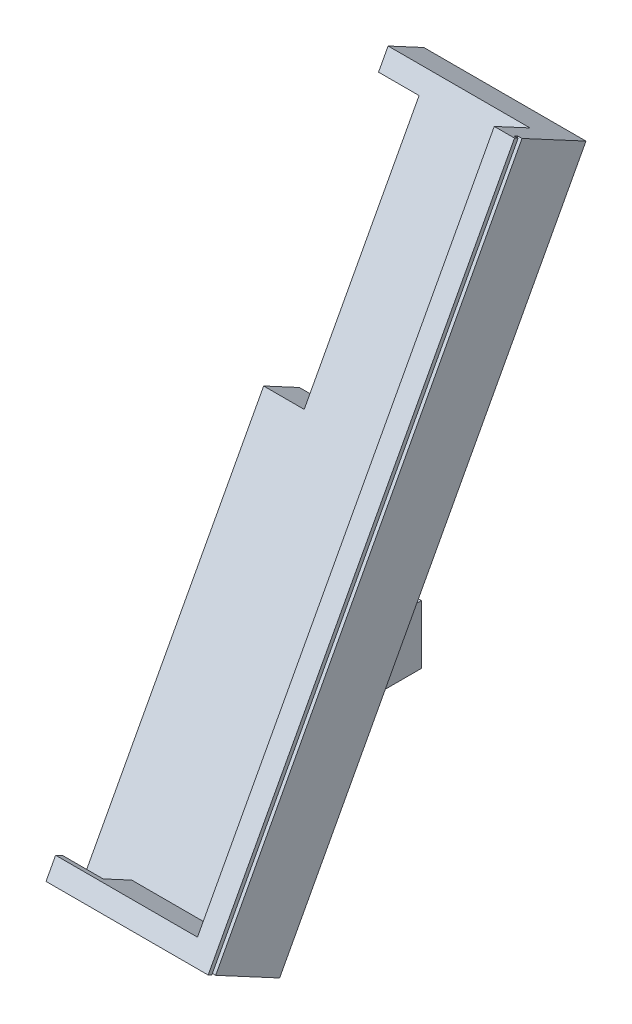
ISO-10303-21;
HEADER;
FILE_DESCRIPTION(('STEP AP214'),'2;1');
FILE_NAME('part.step','',(''),(''),'','','');
FILE_SCHEMA(('AUTOMOTIVE_DESIGN { 1 0 10303 214 1 1 1 1 }'));
ENDSEC;
DATA;
#1=APPLICATION_CONTEXT('core data for automotive mechanical design processes');
#2=APPLICATION_PROTOCOL_DEFINITION('international standard','automotive_design',2000,#1);
#3=PRODUCT_CONTEXT('',#1,'mechanical');
#4=PRODUCT('Part','Part','',(#3));
#5=PRODUCT_RELATED_PRODUCT_CATEGORY('part','',(#4));
#6=PRODUCT_DEFINITION_FORMATION('','',#4);
#7=PRODUCT_DEFINITION_CONTEXT('part definition',#1,'design');
#8=PRODUCT_DEFINITION('design','',#6,#7);
#9=PRODUCT_DEFINITION_SHAPE('','',#8);
#10=(LENGTH_UNIT() NAMED_UNIT(*) SI_UNIT(.MILLI.,.METRE.));
#11=(NAMED_UNIT(*) PLANE_ANGLE_UNIT() SI_UNIT($,.RADIAN.));
#12=(NAMED_UNIT(*) SI_UNIT($,.STERADIAN.) SOLID_ANGLE_UNIT());
#13=UNCERTAINTY_MEASURE_WITH_UNIT(LENGTH_MEASURE(1.E-05),#10,'distance_accuracy_value','');
#14=(GEOMETRIC_REPRESENTATION_CONTEXT(3) GLOBAL_UNCERTAINTY_ASSIGNED_CONTEXT((#13)) GLOBAL_UNIT_ASSIGNED_CONTEXT((#10,
#11,#12)) REPRESENTATION_CONTEXT('',''));
#15=CARTESIAN_POINT('',(0.,0.,0.));
#16=DIRECTION('',(0.,0.,1.));
#17=DIRECTION('',(1.,0.,0.));
#18=AXIS2_PLACEMENT_3D('',#15,#16,#17);
#19=CARTESIAN_POINT('',(40.,-30.9318929415671,64.0386236248852));
#20=DIRECTION('',(-1.,0.,0.));
#21=DIRECTION('',(0.,0.,1.));
#22=AXIS2_PLACEMENT_3D('',#19,#20,#21);
#23=PLANE('',#22);
#24=DIRECTION('',(0.,-0.472398321582941,-0.881385174464388));
#25=VECTOR('',#24,1.);
#26=CARTESIAN_POINT('',(40.,110.089734972735,-11.5451078283854));
#27=LINE('',#26,#25);
#28=CARTESIAN_POINT('',(40.,113.82168171324,-4.58216495011671));
#29=VERTEX_POINT('',#28);
#30=CARTESIAN_POINT('',(40.,105.365751756906,-20.3589595730293));
#31=VERTEX_POINT('',#30);
#32=EDGE_CURVE('E280',#29,#31,#27,.T.);
#33=ORIENTED_EDGE('',*,*,#32,.F.);
#34=DIRECTION('',(0.,0.881385174464388,-0.472398321582942));
#35=VECTOR('',#34,1.);
#36=CARTESIAN_POINT('',(40.,-27.1999462010618,71.001566503154));
#37=LINE('',#36,#35);
#38=CARTESIAN_POINT('',(40.,-27.1999462010618,71.001566503154));
#39=VERTEX_POINT('',#38);
#40=EDGE_CURVE('E329',#39,#29,#37,.T.);
#41=ORIENTED_EDGE('',*,*,#40,.F.);
#42=DIRECTION('',(0.,-0.472398321582941,-0.881385174464388));
#43=VECTOR('',#42,1.);
#44=CARTESIAN_POINT('',(40.,-30.9318929415671,64.0386236248852));
#45=LINE('',#44,#43);
#46=CARTESIAN_POINT('',(40.,-35.6558761573965,55.2247718802414));
#47=VERTEX_POINT('',#46);
#48=EDGE_CURVE('E269',#39,#47,#45,.T.);
#49=ORIENTED_EDGE('',*,*,#48,.T.);
#50=DIRECTION('',(0.,0.881385174464388,-0.472398321582941));
#51=VECTOR('',#50,1.);
#52=CARTESIAN_POINT('',(40.,-35.6558761573965,55.2247718802414));
#53=LINE('',#52,#51);
#54=EDGE_CURVE('E265',#47,#31,#53,.T.);
#55=ORIENTED_EDGE('',*,*,#54,.T.);
#56=EDGE_LOOP('',(#33,#41,#49,#55));
#57=FACE_BOUND('',#56,.T.);
#58=ADVANCED_FACE('F37',(#57),#23,.F.);
#59=CARTESIAN_POINT('',(-40.,-30.9318929415671,64.0386236248852));
#60=DIRECTION('',(0.,0.881385174464388,-0.472398321582941));
#61=DIRECTION('',(0.,0.472398321582941,0.881385174464388));
#62=AXIS2_PLACEMENT_3D('',#59,#60,#61);
#63=PLANE('',#62);
#64=DIRECTION('',(1.,0.,0.));
#65=VECTOR('',#64,1.);
#66=CARTESIAN_POINT('',(-40.,-26.2079097257377,72.8524753695292));
#67=LINE('',#66,#65);
#68=CARTESIAN_POINT('',(0.,-26.2079097257377,72.8524753695292));
#69=VERTEX_POINT('',#68);
#70=CARTESIAN_POINT('',(40.,-26.2079097257377,72.8524753695292));
#71=VERTEX_POINT('',#70);
#72=EDGE_CURVE('E200',#69,#71,#67,.T.);
#73=ORIENTED_EDGE('',*,*,#72,.F.);
#74=DIRECTION('',(0.,-0.472398321582941,-0.881385174464388));
#75=VECTOR('',#74,1.);
#76=CARTESIAN_POINT('',(0.,-30.9318929415671,64.0386236248852));
#77=LINE('',#76,#75);
#78=CARTESIAN_POINT('',(0.,-27.1527063689036,71.0897050206003));
#79=VERTEX_POINT('',#78);
#80=EDGE_CURVE('E186',#69,#79,#77,.T.);
#81=ORIENTED_EDGE('',*,*,#80,.T.);
#82=DIRECTION('',(-1.,0.,0.));
#83=VECTOR('',#82,1.);
#84=CARTESIAN_POINT('',(-10.0273045150152,-27.1527063689036,71.0897050206003));
#85=LINE('',#84,#83);
#86=CARTESIAN_POINT('',(9.97269548498479,-27.1527063689036,71.0897050206003));
#87=VERTEX_POINT('',#86);
#88=EDGE_CURVE('E198',#87,#79,#85,.T.);
#89=ORIENTED_EDGE('',*,*,#88,.F.);
#90=DIRECTION('',(0.,0.472398321582942,0.881385174464388));
#91=VECTOR('',#90,1.);
#92=CARTESIAN_POINT('',(9.9726954849848,-30.9318929415671,64.0386236248852));
#93=LINE('',#92,#91);
#94=CARTESIAN_POINT('',(9.9726954849848,-30.9318929415671,64.0386236248852));
#95=VERTEX_POINT('',#94);
#96=EDGE_CURVE('E209',#95,#87,#93,.T.);
#97=ORIENTED_EDGE('',*,*,#96,.F.);
#98=DIRECTION('',(1.,0.,0.));
#99=VECTOR('',#98,1.);
#100=CARTESIAN_POINT('',(-10.0273045150152,-30.9318929415671,64.0386236248852));
#101=LINE('',#100,#99);
#102=CARTESIAN_POINT('',(0.,-30.9318929415671,64.0386236248853));
#103=VERTEX_POINT('',#102);
#104=EDGE_CURVE('E208',#103,#95,#101,.T.);
#105=ORIENTED_EDGE('',*,*,#104,.F.);
#106=CARTESIAN_POINT('',(0.,-35.6558761573965,55.2247718802414));
#107=VERTEX_POINT('',#106);
#108=EDGE_CURVE('E203',#103,#107,#77,.T.);
#109=ORIENTED_EDGE('',*,*,#108,.T.);
#110=DIRECTION('',(1.,0.,0.));
#111=VECTOR('',#110,1.);
#112=CARTESIAN_POINT('',(-40.,-35.6558761573965,55.2247718802414));
#113=LINE('',#112,#111);
#114=EDGE_CURVE('E270',#107,#47,#113,.T.);
#115=ORIENTED_EDGE('',*,*,#114,.T.);
#116=ORIENTED_EDGE('',*,*,#48,.F.);
#117=DIRECTION('',(1.,0.,0.));
#118=VECTOR('',#117,1.);
#119=CARTESIAN_POINT('',(39.,-27.1999462010618,71.001566503154));
#120=LINE('',#119,#118);
#121=CARTESIAN_POINT('',(39.,-27.1999462010618,71.001566503154));
#122=VERTEX_POINT('',#121);
#123=EDGE_CURVE('E332',#122,#39,#120,.T.);
#124=ORIENTED_EDGE('',*,*,#123,.F.);
#125=DIRECTION('',(0.,-0.47239832158294,-0.881385174464389));
#126=VECTOR('',#125,1.);
#127=CARTESIAN_POINT('',(39.,-26.6803080473206,71.9710901950648));
#128=LINE('',#127,#126);
#129=CARTESIAN_POINT('',(39.,-26.6803080473206,71.9710901950648));
#130=VERTEX_POINT('',#129);
#131=EDGE_CURVE('E334',#130,#122,#128,.T.);
#132=ORIENTED_EDGE('',*,*,#131,.F.);
#133=DIRECTION('',(1.,0.,0.));
#134=VECTOR('',#133,1.);
#135=CARTESIAN_POINT('',(39.,-26.6803080473206,71.9710901950648));
#136=LINE('',#135,#134);
#137=CARTESIAN_POINT('',(40.,-26.6803080473206,71.9710901950648));
#138=VERTEX_POINT('',#137);
#139=EDGE_CURVE('E337',#130,#138,#136,.T.);
#140=ORIENTED_EDGE('',*,*,#139,.T.);
#141=EDGE_CURVE('E277',#71,#138,#45,.T.);
#142=ORIENTED_EDGE('',*,*,#141,.F.);
#143=EDGE_LOOP('',(#73,#81,#89,#97,#105,#109,#115,#116,#124,#132,#140,#142));
#144=FACE_BOUND('',#143,.T.);
#145=ADVANCED_FACE('F196',(#144),#63,.F.);
#146=CARTESIAN_POINT('',(0.,19.7606670360328,36.868799416402));
#147=DIRECTION('',(0.,-0.472398321582942,-0.881385174464388));
#148=DIRECTION('',(0.,0.881385174464388,-0.472398321582942));
#149=AXIS2_PLACEMENT_3D('',#146,#147,#148);
#150=PLANE('',#149);
#151=DIRECTION('',(-1.,0.,0.));
#152=VECTOR('',#151,1.);
#153=CARTESIAN_POINT('',(-40.,110.089734972735,-11.5451078283854));
#154=LINE('',#153,#152);
#155=CARTESIAN_POINT('',(35.,110.089734972735,-11.5451078283854));
#156=VERTEX_POINT('',#155);
#157=CARTESIAN_POINT('',(0.,110.089734972735,-11.5451078283854));
#158=VERTEX_POINT('',#157);
#159=EDGE_CURVE('E266',#156,#158,#154,.T.);
#160=ORIENTED_EDGE('',*,*,#159,.T.);
#161=DIRECTION('',(0.,-0.881385174464388,0.472398321582942));
#162=VECTOR('',#161,1.);
#163=CARTESIAN_POINT('',(0.,19.7606670360328,36.868799416402));
#164=LINE('',#163,#162);
#165=CARTESIAN_POINT('',(0.,105.682809100413,-9.18311622047066));
#166=VERTEX_POINT('',#165);
#167=EDGE_CURVE('E376',#158,#166,#164,.T.);
#168=ORIENTED_EDGE('',*,*,#167,.T.);
#169=DIRECTION('',(-1.,0.,0.));
#170=VECTOR('',#169,1.);
#171=CARTESIAN_POINT('',(-30.,105.682809100413,-9.18311622047065));
#172=LINE('',#171,#170);
#173=CARTESIAN_POINT('',(9.99999999999999,105.682809100413,-9.18311622047067));
#174=VERTEX_POINT('',#173);
#175=EDGE_CURVE('E232',#174,#166,#172,.T.);
#176=ORIENTED_EDGE('',*,*,#175,.F.);
#177=DIRECTION('',(0.,0.881385174464388,-0.472398321582941));
#178=VECTOR('',#177,1.);
#179=CARTESIAN_POINT('',(9.99999999999999,52.7996986325498,19.1607830745058));
#180=LINE('',#179,#178);
#181=CARTESIAN_POINT('',(9.99999999999999,52.7996986325498,19.1607830745058));
#182=VERTEX_POINT('',#181);
#183=EDGE_CURVE('E219',#182,#174,#180,.T.);
#184=ORIENTED_EDGE('',*,*,#183,.F.);
#185=DIRECTION('',(1.,0.,0.));
#186=VECTOR('',#185,1.);
#187=CARTESIAN_POINT('',(-30.,52.7996986325498,19.1607830745058));
#188=LINE('',#187,#186);
#189=CARTESIAN_POINT('',(0.,52.7996986325498,19.1607830745058));
#190=VERTEX_POINT('',#189);
#191=EDGE_CURVE('E225',#190,#182,#188,.T.);
#192=ORIENTED_EDGE('',*,*,#191,.F.);
#193=EDGE_CURVE('E52',#190,#103,#164,.T.);
#194=ORIENTED_EDGE('',*,*,#193,.T.);
#195=ORIENTED_EDGE('',*,*,#104,.T.);
#196=DIRECTION('',(0.,-0.881385174464388,0.472398321582942));
#197=VECTOR('',#196,1.);
#198=CARTESIAN_POINT('',(9.9726954849848,-22.1180411969232,59.3146404090558));
#199=LINE('',#198,#197);
#200=CARTESIAN_POINT('',(9.9726954849848,-26.5249670692452,61.6766320169705));
#201=VERTEX_POINT('',#200);
#202=EDGE_CURVE('E216',#201,#95,#199,.T.);
#203=ORIENTED_EDGE('',*,*,#202,.F.);
#204=DIRECTION('',(-1.,0.,0.));
#205=VECTOR('',#204,1.);
#206=CARTESIAN_POINT('',(-35.,-26.5249670692452,61.6766320169706));
#207=LINE('',#206,#205);
#208=CARTESIAN_POINT('',(35.,-26.5249670692452,61.6766320169705));
#209=VERTEX_POINT('',#208);
#210=EDGE_CURVE('E246',#209,#201,#207,.T.);
#211=ORIENTED_EDGE('',*,*,#210,.F.);
#212=DIRECTION('',(0.,-0.881385174464388,0.472398321582942));
#213=VECTOR('',#212,1.);
#214=CARTESIAN_POINT('',(35.,-26.5249670692452,61.6766320169706));
#215=LINE('',#214,#213);
#216=EDGE_CURVE('E239',#156,#209,#215,.T.);
#217=ORIENTED_EDGE('',*,*,#216,.F.);
#218=EDGE_LOOP('',(#160,#168,#176,#184,#192,#194,#195,#203,#211,#217));
#219=FACE_BOUND('',#218,.T.);
#220=ADVANCED_FACE('F312',(#219),#150,.F.);
#221=CARTESIAN_POINT('',(19.75,-7.25,40.));
#222=DIRECTION('',(-1.,0.,0.));
#223=DIRECTION('',(0.,0.,1.));
#224=AXIS2_PLACEMENT_3D('',#221,#222,#223);
#225=PLANE('',#224);
#226=DIRECTION('',(0.,0.,-1.));
#227=VECTOR('',#226,1.);
#228=CARTESIAN_POINT('',(19.75,7.25,40.));
#229=LINE('',#228,#227);
#230=CARTESIAN_POINT('',(19.75,7.25,32.2283970034835));
#231=VERTEX_POINT('',#230);
#232=CARTESIAN_POINT('',(19.75,7.25,0.));
#233=VERTEX_POINT('',#232);
#234=EDGE_CURVE('E302',#231,#233,#229,.T.);
#235=ORIENTED_EDGE('',*,*,#234,.F.);
#236=DIRECTION('',(0.,-0.881385174464388,0.472398321582942));
#237=VECTOR('',#236,1.);
#238=CARTESIAN_POINT('',(19.75,-7.24999999999999,40.));
#239=LINE('',#238,#237);
#240=CARTESIAN_POINT('',(19.75,-7.24999999999994,40.));
#241=VERTEX_POINT('',#240);
#242=EDGE_CURVE('E286',#231,#241,#239,.T.);
#243=ORIENTED_EDGE('',*,*,#242,.T.);
#244=DIRECTION('',(0.,0.,-1.));
#245=VECTOR('',#244,1.);
#246=CARTESIAN_POINT('',(19.75,-7.25,40.));
#247=LINE('',#246,#245);
#248=CARTESIAN_POINT('',(19.75,-7.25,0.));
#249=VERTEX_POINT('',#248);
#250=EDGE_CURVE('E292',#241,#249,#247,.T.);
#251=ORIENTED_EDGE('',*,*,#250,.T.);
#252=DIRECTION('',(0.,1.,0.));
#253=VECTOR('',#252,1.);
#254=CARTESIAN_POINT('',(19.75,-7.25,0.));
#255=LINE('',#254,#253);
#256=EDGE_CURVE('E289',#249,#233,#255,.T.);
#257=ORIENTED_EDGE('',*,*,#256,.T.);
#258=EDGE_LOOP('',(#235,#243,#251,#257));
#259=FACE_BOUND('',#258,.T.);
#260=ADVANCED_FACE('F39',(#259),#225,.F.);
#261=CARTESIAN_POINT('',(-19.75,7.25,40.));
#262=DIRECTION('',(0.,-1.,0.));
#263=DIRECTION('',(0.,0.,-1.));
#264=AXIS2_PLACEMENT_3D('',#261,#262,#263);
#265=PLANE('',#264);
#266=DIRECTION('',(-1.,0.,0.));
#267=VECTOR('',#266,1.);
#268=CARTESIAN_POINT('',(-19.75,7.25,0.));
#269=LINE('',#268,#267);
#270=CARTESIAN_POINT('',(0.,7.25,0.));
#271=VERTEX_POINT('',#270);
#272=EDGE_CURVE('E296',#233,#271,#269,.T.);
#273=ORIENTED_EDGE('',*,*,#272,.T.);
#274=DIRECTION('',(0.,0.,1.));
#275=VECTOR('',#274,1.);
#276=CARTESIAN_POINT('',(0.,7.25,40.));
#277=LINE('',#276,#275);
#278=CARTESIAN_POINT('',(0.,7.25,32.2283970034835));
#279=VERTEX_POINT('',#278);
#280=EDGE_CURVE('E367',#271,#279,#277,.T.);
#281=ORIENTED_EDGE('',*,*,#280,.T.);
#282=DIRECTION('',(1.,0.,0.));
#283=VECTOR('',#282,1.);
#284=CARTESIAN_POINT('',(-19.75,7.25,32.2283970034835));
#285=LINE('',#284,#283);
#286=EDGE_CURVE('E284',#279,#231,#285,.T.);
#287=ORIENTED_EDGE('',*,*,#286,.T.);
#288=ORIENTED_EDGE('',*,*,#234,.T.);
#289=EDGE_LOOP('',(#273,#281,#287,#288));
#290=FACE_BOUND('',#289,.T.);
#291=ADVANCED_FACE('F423',(#290),#265,.F.);
#292=CARTESIAN_POINT('',(-19.75,-7.25,40.));
#293=DIRECTION('',(0.,1.,0.));
#294=DIRECTION('',(0.,0.,1.));
#295=AXIS2_PLACEMENT_3D('',#292,#293,#294);
#296=PLANE('',#295);
#297=DIRECTION('',(1.,0.,0.));
#298=VECTOR('',#297,1.);
#299=CARTESIAN_POINT('',(-19.75,-7.25,40.));
#300=LINE('',#299,#298);
#301=CARTESIAN_POINT('',(0.,-7.24999999999997,40.));
#302=VERTEX_POINT('',#301);
#303=EDGE_CURVE('E290',#302,#241,#300,.T.);
#304=ORIENTED_EDGE('',*,*,#303,.F.);
#305=DIRECTION('',(0.,0.,-1.));
#306=VECTOR('',#305,1.);
#307=CARTESIAN_POINT('',(0.,-7.25,40.));
#308=LINE('',#307,#306);
#309=CARTESIAN_POINT('',(0.,-7.25,0.));
#310=VERTEX_POINT('',#309);
#311=EDGE_CURVE('E357',#302,#310,#308,.T.);
#312=ORIENTED_EDGE('',*,*,#311,.T.);
#313=DIRECTION('',(1.,0.,0.));
#314=VECTOR('',#313,1.);
#315=CARTESIAN_POINT('',(-19.75,-7.25,0.));
#316=LINE('',#315,#314);
#317=EDGE_CURVE('E293',#310,#249,#316,.T.);
#318=ORIENTED_EDGE('',*,*,#317,.T.);
#319=ORIENTED_EDGE('',*,*,#250,.F.);
#320=EDGE_LOOP('',(#304,#312,#318,#319));
#321=FACE_BOUND('',#320,.T.);
#322=ADVANCED_FACE('F414',(#321),#296,.F.);
#323=CARTESIAN_POINT('',(0.,0.,0.));
#324=DIRECTION('',(0.,0.,-1.));
#325=DIRECTION('',(-1.,0.,0.));
#326=AXIS2_PLACEMENT_3D('',#323,#324,#325);
#327=PLANE('',#326);
#328=DIRECTION('',(0.,-1.,0.));
#329=VECTOR('',#328,1.);
#330=CARTESIAN_POINT('',(0.,0.,0.));
#331=LINE('',#330,#329);
#332=EDGE_CURVE('E365',#271,#310,#331,.T.);
#333=ORIENTED_EDGE('',*,*,#332,.F.);
#334=ORIENTED_EDGE('',*,*,#272,.F.);
#335=ORIENTED_EDGE('',*,*,#256,.F.);
#336=ORIENTED_EDGE('',*,*,#317,.F.);
#337=EDGE_LOOP('',(#333,#334,#335,#336));
#338=FACE_BOUND('',#337,.T.);
#339=ADVANCED_FACE('F418',(#338),#327,.T.);
#340=CARTESIAN_POINT('',(0.,15.0366838202034,28.0549476717581));
#341=DIRECTION('',(0.,-0.472398321582942,-0.881385174464388));
#342=DIRECTION('',(0.,0.881385174464388,-0.472398321582942));
#343=AXIS2_PLACEMENT_3D('',#340,#341,#342);
#344=PLANE('',#343);
#345=DIRECTION('',(0.,-0.881385174464388,0.472398321582942));
#346=VECTOR('',#345,1.);
#347=CARTESIAN_POINT('',(0.,15.0366838202034,28.0549476717581));
#348=LINE('',#347,#346);
#349=CARTESIAN_POINT('',(0.,105.365751756906,-20.3589595730293));
#350=VERTEX_POINT('',#349);
#351=CARTESIAN_POINT('',(0.,100.958825884584,-17.9969679651145));
#352=VERTEX_POINT('',#351);
#353=EDGE_CURVE('E60',#350,#352,#348,.T.);
#354=ORIENTED_EDGE('',*,*,#353,.F.);
#355=DIRECTION('',(-1.,0.,0.));
#356=VECTOR('',#355,1.);
#357=CARTESIAN_POINT('',(-40.,105.365751756906,-20.3589595730293));
#358=LINE('',#357,#356);
#359=EDGE_CURVE('E273',#31,#350,#358,.T.);
#360=ORIENTED_EDGE('',*,*,#359,.F.);
#361=ORIENTED_EDGE('',*,*,#54,.F.);
#362=ORIENTED_EDGE('',*,*,#114,.F.);
#363=EDGE_CURVE('E319',#302,#107,#348,.T.);
#364=ORIENTED_EDGE('',*,*,#363,.F.);
#365=ORIENTED_EDGE('',*,*,#303,.T.);
#366=ORIENTED_EDGE('',*,*,#242,.F.);
#367=ORIENTED_EDGE('',*,*,#286,.F.);
#368=CARTESIAN_POINT('',(0.,48.0757154167204,10.3469313298619));
#369=VERTEX_POINT('',#368);
#370=EDGE_CURVE('E370',#369,#279,#348,.T.);
#371=ORIENTED_EDGE('',*,*,#370,.F.);
#372=DIRECTION('',(1.,0.,0.));
#373=VECTOR('',#372,1.);
#374=CARTESIAN_POINT('',(-30.,48.0757154167204,10.3469313298619));
#375=LINE('',#374,#373);
#376=CARTESIAN_POINT('',(9.99999999999999,48.0757154167204,10.3469313298619));
#377=VERTEX_POINT('',#376);
#378=EDGE_CURVE('E228',#369,#377,#375,.T.);
#379=ORIENTED_EDGE('',*,*,#378,.T.);
#380=DIRECTION('',(0.,0.881385174464388,-0.472398321582941));
#381=VECTOR('',#380,1.);
#382=CARTESIAN_POINT('',(9.99999999999999,48.0757154167204,10.3469313298619));
#383=LINE('',#382,#381);
#384=CARTESIAN_POINT('',(9.99999999999999,100.958825884584,-17.9969679651145));
#385=VERTEX_POINT('',#384);
#386=EDGE_CURVE('E221',#377,#385,#383,.T.);
#387=ORIENTED_EDGE('',*,*,#386,.T.);
#388=DIRECTION('',(-1.,0.,0.));
#389=VECTOR('',#388,1.);
#390=CARTESIAN_POINT('',(-30.,100.958825884584,-17.9969679651145));
#391=LINE('',#390,#389);
#392=EDGE_CURVE('E224',#385,#352,#391,.T.);
#393=ORIENTED_EDGE('',*,*,#392,.T.);
#394=EDGE_LOOP('',(#354,#360,#361,#362,#364,#365,#366,#367,#371,#379,#387,#393));
#395=FACE_BOUND('',#394,.T.);
#396=ADVANCED_FACE('F323',(#395),#344,.T.);
#397=ORIENTED_EDGE('',*,*,#141,.T.);
#398=DIRECTION('',(0.,-0.881385174464388,0.472398321582941));
#399=VECTOR('',#398,1.);
#400=CARTESIAN_POINT('',(40.,114.341319866981,-3.61264125820589));
#401=LINE('',#400,#399);
#402=CARTESIAN_POINT('',(40.,114.341319866981,-3.61264125820589));
#403=VERTEX_POINT('',#402);
#404=EDGE_CURVE('E356',#403,#138,#401,.T.);
#405=ORIENTED_EDGE('',*,*,#404,.F.);
#406=CARTESIAN_POINT('',(40.,114.813718188564,-2.73125608374151));
#407=VERTEX_POINT('',#406);
#408=EDGE_CURVE('E281',#407,#403,#27,.T.);
#409=ORIENTED_EDGE('',*,*,#408,.F.);
#410=DIRECTION('',(0.,0.881385174464388,-0.472398321582942));
#411=VECTOR('',#410,1.);
#412=CARTESIAN_POINT('',(40.,-26.2079097257377,72.8524753695292));
#413=LINE('',#412,#411);
#414=EDGE_CURVE('E252',#71,#407,#413,.T.);
#415=ORIENTED_EDGE('',*,*,#414,.F.);
#416=EDGE_LOOP('',(#397,#405,#409,#415));
#417=FACE_BOUND('',#416,.T.);
#418=ADVANCED_FACE('F433',(#417),#23,.F.);
#419=CARTESIAN_POINT('',(-40.,110.089734972735,-11.5451078283854));
#420=DIRECTION('',(0.,-0.881385174464388,0.472398321582941));
#421=DIRECTION('',(0.,-0.472398321582941,-0.881385174464388));
#422=AXIS2_PLACEMENT_3D('',#419,#420,#421);
#423=PLANE('',#422);
#424=ORIENTED_EDGE('',*,*,#359,.T.);
#425=DIRECTION('',(0.,0.472398321582941,0.881385174464388));
#426=VECTOR('',#425,1.);
#427=CARTESIAN_POINT('',(0.,110.089734972735,-11.5451078283854));
#428=LINE('',#427,#426);
#429=EDGE_CURVE('E373',#350,#158,#428,.T.);
#430=ORIENTED_EDGE('',*,*,#429,.T.);
#431=ORIENTED_EDGE('',*,*,#159,.F.);
#432=DIRECTION('',(0.,-0.472398321582942,-0.881385174464388));
#433=VECTOR('',#432,1.);
#434=CARTESIAN_POINT('',(35.,114.813718188564,-2.7312560837415));
#435=LINE('',#434,#433);
#436=CARTESIAN_POINT('',(35.,114.813718188564,-2.7312560837415));
#437=VERTEX_POINT('',#436);
#438=EDGE_CURVE('E262',#437,#156,#435,.T.);
#439=ORIENTED_EDGE('',*,*,#438,.F.);
#440=DIRECTION('',(-1.,0.,0.));
#441=VECTOR('',#440,1.);
#442=CARTESIAN_POINT('',(40.,114.813718188564,-2.73125608374151));
#443=LINE('',#442,#441);
#444=EDGE_CURVE('E242',#407,#437,#443,.T.);
#445=ORIENTED_EDGE('',*,*,#444,.F.);
#446=ORIENTED_EDGE('',*,*,#408,.T.);
#447=DIRECTION('',(1.,0.,0.));
#448=VECTOR('',#447,1.);
#449=CARTESIAN_POINT('',(39.,114.341319866981,-3.61264125820589));
#450=LINE('',#449,#448);
#451=CARTESIAN_POINT('',(39.,114.341319866981,-3.61264125820589));
#452=VERTEX_POINT('',#451);
#453=EDGE_CURVE('E341',#452,#403,#450,.T.);
#454=ORIENTED_EDGE('',*,*,#453,.F.);
#455=DIRECTION('',(0.,0.472398321582939,0.881385174464389));
#456=VECTOR('',#455,1.);
#457=CARTESIAN_POINT('',(39.,113.82168171324,-4.58216495011671));
#458=LINE('',#457,#456);
#459=CARTESIAN_POINT('',(39.,113.82168171324,-4.58216495011671));
#460=VERTEX_POINT('',#459);
#461=EDGE_CURVE('E358',#460,#452,#458,.T.);
#462=ORIENTED_EDGE('',*,*,#461,.F.);
#463=DIRECTION('',(1.,0.,0.));
#464=VECTOR('',#463,1.);
#465=CARTESIAN_POINT('',(39.,113.82168171324,-4.58216495011671));
#466=LINE('',#465,#464);
#467=EDGE_CURVE('E212',#460,#29,#466,.T.);
#468=ORIENTED_EDGE('',*,*,#467,.T.);
#469=ORIENTED_EDGE('',*,*,#32,.T.);
#470=EDGE_LOOP('',(#424,#430,#431,#439,#445,#446,#454,#462,#468,#469));
#471=FACE_BOUND('',#470,.T.);
#472=ADVANCED_FACE('F393',(#471),#423,.F.);
#473=CARTESIAN_POINT('',(35.,-21.8009838534158,70.4904837616144));
#474=DIRECTION('',(1.,0.,0.));
#475=DIRECTION('',(0.,0.,-1.));
#476=AXIS2_PLACEMENT_3D('',#473,#474,#475);
#477=PLANE('',#476);
#478=ORIENTED_EDGE('',*,*,#216,.T.);
#479=DIRECTION('',(0.,-0.472398321582942,-0.881385174464388));
#480=VECTOR('',#479,1.);
#481=CARTESIAN_POINT('',(35.,-21.8009838534158,70.4904837616144));
#482=LINE('',#481,#480);
#483=CARTESIAN_POINT('',(35.,-21.8009838534158,70.4904837616144));
#484=VERTEX_POINT('',#483);
#485=EDGE_CURVE('E255',#484,#209,#482,.T.);
#486=ORIENTED_EDGE('',*,*,#485,.F.);
#487=DIRECTION('',(0.,-0.881385174464388,0.472398321582942));
#488=VECTOR('',#487,1.);
#489=CARTESIAN_POINT('',(35.,-21.8009838534158,70.4904837616144));
#490=LINE('',#489,#488);
#491=EDGE_CURVE('E245',#437,#484,#490,.T.);
#492=ORIENTED_EDGE('',*,*,#491,.F.);
#493=ORIENTED_EDGE('',*,*,#438,.T.);
#494=EDGE_LOOP('',(#478,#486,#492,#493));
#495=FACE_BOUND('',#494,.T.);
#496=ADVANCED_FACE('F390',(#495),#477,.F.);
#497=CARTESIAN_POINT('',(-35.,-21.8009838534158,70.4904837616144));
#498=DIRECTION('',(0.,-0.881385174464388,0.472398321582942));
#499=DIRECTION('',(0.,-0.472398321582942,-0.881385174464388));
#500=AXIS2_PLACEMENT_3D('',#497,#498,#499);
#501=PLANE('',#500);
#502=DIRECTION('',(-1.,0.,0.));
#503=VECTOR('',#502,1.);
#504=CARTESIAN_POINT('',(-35.,-22.7457804965817,68.7277134126856));
#505=LINE('',#504,#503);
#506=CARTESIAN_POINT('',(9.9726954849848,-22.7457804965816,68.7277134126856));
#507=VERTEX_POINT('',#506);
#508=CARTESIAN_POINT('',(0.,-22.7457804965817,68.7277134126856));
#509=VERTEX_POINT('',#508);
#510=EDGE_CURVE('E304',#507,#509,#505,.T.);
#511=ORIENTED_EDGE('',*,*,#510,.T.);
#512=DIRECTION('',(0.,0.472398321582942,0.881385174464388));
#513=VECTOR('',#512,1.);
#514=CARTESIAN_POINT('',(0.,-21.8009838534158,70.4904837616144));
#515=LINE('',#514,#513);
#516=CARTESIAN_POINT('',(0.,-21.8009838534158,70.4904837616144));
#517=VERTEX_POINT('',#516);
#518=EDGE_CURVE('E189',#509,#517,#515,.T.);
#519=ORIENTED_EDGE('',*,*,#518,.T.);
#520=DIRECTION('',(-1.,0.,0.));
#521=VECTOR('',#520,1.);
#522=CARTESIAN_POINT('',(-35.,-21.8009838534158,70.4904837616144));
#523=LINE('',#522,#521);
#524=EDGE_CURVE('E248',#484,#517,#523,.T.);
#525=ORIENTED_EDGE('',*,*,#524,.F.);
#526=ORIENTED_EDGE('',*,*,#485,.T.);
#527=ORIENTED_EDGE('',*,*,#210,.T.);
#528=DIRECTION('',(0.,0.472398321582942,0.881385174464388));
#529=VECTOR('',#528,1.);
#530=CARTESIAN_POINT('',(9.9726954849848,-21.8009838534158,70.4904837616144));
#531=LINE('',#530,#529);
#532=EDGE_CURVE('E45',#201,#507,#531,.T.);
#533=ORIENTED_EDGE('',*,*,#532,.T.);
#534=EDGE_LOOP('',(#511,#519,#525,#526,#527,#533));
#535=FACE_BOUND('',#534,.T.);
#536=ADVANCED_FACE('F307',(#535),#501,.F.);
#537=CARTESIAN_POINT('',(0.,24.4846502518622,45.6826511610459));
#538=DIRECTION('',(0.,-0.472398321582942,-0.881385174464388));
#539=DIRECTION('',(0.,0.881385174464388,-0.472398321582942));
#540=AXIS2_PLACEMENT_3D('',#537,#538,#539);
#541=PLANE('',#540);
#542=ORIENTED_EDGE('',*,*,#524,.T.);
#543=DIRECTION('',(0.,-0.881385174464388,0.472398321582942));
#544=VECTOR('',#543,1.);
#545=CARTESIAN_POINT('',(0.,24.4846502518622,45.6826511610459));
#546=LINE('',#545,#544);
#547=EDGE_CURVE('E201',#517,#69,#546,.T.);
#548=ORIENTED_EDGE('',*,*,#547,.T.);
#549=ORIENTED_EDGE('',*,*,#72,.T.);
#550=ORIENTED_EDGE('',*,*,#414,.T.);
#551=ORIENTED_EDGE('',*,*,#444,.T.);
#552=ORIENTED_EDGE('',*,*,#491,.T.);
#553=EDGE_LOOP('',(#542,#548,#549,#550,#551,#552));
#554=FACE_BOUND('',#553,.T.);
#555=ADVANCED_FACE('F385',(#554),#541,.F.);
#556=CARTESIAN_POINT('',(9.99999999999999,48.0757154167204,10.3469313298619));
#557=DIRECTION('',(1.,0.,0.));
#558=DIRECTION('',(0.,0.,-1.));
#559=AXIS2_PLACEMENT_3D('',#556,#557,#558);
#560=PLANE('',#559);
#561=ORIENTED_EDGE('',*,*,#183,.T.);
#562=DIRECTION('',(0.,0.472398321582941,0.881385174464388));
#563=VECTOR('',#562,1.);
#564=CARTESIAN_POINT('',(9.99999999999999,100.958825884584,-17.9969679651145));
#565=LINE('',#564,#563);
#566=EDGE_CURVE('E230',#385,#174,#565,.T.);
#567=ORIENTED_EDGE('',*,*,#566,.F.);
#568=ORIENTED_EDGE('',*,*,#386,.F.);
#569=DIRECTION('',(0.,0.472398321582941,0.881385174464388));
#570=VECTOR('',#569,1.);
#571=CARTESIAN_POINT('',(9.99999999999999,48.0757154167204,10.3469313298619));
#572=LINE('',#571,#570);
#573=EDGE_CURVE('E236',#377,#182,#572,.T.);
#574=ORIENTED_EDGE('',*,*,#573,.T.);
#575=EDGE_LOOP('',(#561,#567,#568,#574));
#576=FACE_BOUND('',#575,.T.);
#577=ADVANCED_FACE('F402',(#576),#560,.F.);
#578=CARTESIAN_POINT('',(-30.,48.0757154167204,10.3469313298619));
#579=DIRECTION('',(0.,-0.881385174464388,0.472398321582941));
#580=DIRECTION('',(0.,-0.472398321582941,-0.881385174464388));
#581=AXIS2_PLACEMENT_3D('',#578,#579,#580);
#582=PLANE('',#581);
#583=ORIENTED_EDGE('',*,*,#378,.F.);
#584=DIRECTION('',(0.,0.472398321582941,0.881385174464388));
#585=VECTOR('',#584,1.);
#586=CARTESIAN_POINT('',(0.,48.0757154167204,10.3469313298619));
#587=LINE('',#586,#585);
#588=EDGE_CURVE('E371',#369,#190,#587,.T.);
#589=ORIENTED_EDGE('',*,*,#588,.T.);
#590=ORIENTED_EDGE('',*,*,#191,.T.);
#591=ORIENTED_EDGE('',*,*,#573,.F.);
#592=EDGE_LOOP('',(#583,#589,#590,#591));
#593=FACE_BOUND('',#592,.T.);
#594=ADVANCED_FACE('F406',(#593),#582,.F.);
#595=CARTESIAN_POINT('',(-30.,100.958825884584,-17.9969679651145));
#596=DIRECTION('',(0.,0.881385174464388,-0.472398321582941));
#597=DIRECTION('',(0.,0.472398321582941,0.881385174464388));
#598=AXIS2_PLACEMENT_3D('',#595,#596,#597);
#599=PLANE('',#598);
#600=ORIENTED_EDGE('',*,*,#175,.T.);
#601=DIRECTION('',(0.,-0.472398321582941,-0.881385174464388));
#602=VECTOR('',#601,1.);
#603=CARTESIAN_POINT('',(0.,100.958825884584,-17.9969679651145));
#604=LINE('',#603,#602);
#605=EDGE_CURVE('E380',#166,#352,#604,.T.);
#606=ORIENTED_EDGE('',*,*,#605,.T.);
#607=ORIENTED_EDGE('',*,*,#392,.F.);
#608=ORIENTED_EDGE('',*,*,#566,.T.);
#609=EDGE_LOOP('',(#600,#606,#607,#608));
#610=FACE_BOUND('',#609,.T.);
#611=ADVANCED_FACE('F398',(#610),#599,.F.);
#612=CARTESIAN_POINT('',(9.9726954849848,-22.1180411969232,59.3146404090558));
#613=DIRECTION('',(1.,0.,0.));
#614=DIRECTION('',(0.,0.,-1.));
#615=AXIS2_PLACEMENT_3D('',#612,#613,#614);
#616=PLANE('',#615);
#617=ORIENTED_EDGE('',*,*,#202,.T.);
#618=ORIENTED_EDGE('',*,*,#96,.T.);
#619=DIRECTION('',(0.,-0.881385174464388,0.472398321582942));
#620=VECTOR('',#619,1.);
#621=CARTESIAN_POINT('',(9.9726954849848,-18.3388546242597,66.3657218047709));
#622=LINE('',#621,#620);
#623=EDGE_CURVE('E207',#507,#87,#622,.T.);
#624=ORIENTED_EDGE('',*,*,#623,.F.);
#625=ORIENTED_EDGE('',*,*,#532,.F.);
#626=EDGE_LOOP('',(#617,#618,#624,#625));
#627=FACE_BOUND('',#626,.T.);
#628=ADVANCED_FACE('F310',(#627),#616,.F.);
#629=CARTESIAN_POINT('',(-10.0273045150152,-18.3388546242597,66.3657218047709));
#630=DIRECTION('',(0.,0.472398321582942,0.881385174464388));
#631=DIRECTION('',(0.,-0.881385174464388,0.472398321582942));
#632=AXIS2_PLACEMENT_3D('',#629,#630,#631);
#633=PLANE('',#632);
#634=ORIENTED_EDGE('',*,*,#88,.T.);
#635=DIRECTION('',(0.,0.881385174464388,-0.472398321582942));
#636=VECTOR('',#635,1.);
#637=CARTESIAN_POINT('',(0.,-18.3388546242597,66.3657218047709));
#638=LINE('',#637,#636);
#639=EDGE_CURVE('E11',#79,#509,#638,.T.);
#640=ORIENTED_EDGE('',*,*,#639,.T.);
#641=ORIENTED_EDGE('',*,*,#510,.F.);
#642=ORIENTED_EDGE('',*,*,#623,.T.);
#643=EDGE_LOOP('',(#634,#640,#641,#642));
#644=FACE_BOUND('',#643,.T.);
#645=ADVANCED_FACE('F205',(#644),#633,.F.);
#646=CARTESIAN_POINT('',(39.,-27.1999462010618,71.001566503154));
#647=DIRECTION('',(0.,-0.472398321582942,-0.881385174464388));
#648=DIRECTION('',(0.,0.881385174464388,-0.472398321582942));
#649=AXIS2_PLACEMENT_3D('',#646,#647,#648);
#650=PLANE('',#649);
#651=ORIENTED_EDGE('',*,*,#40,.T.);
#652=ORIENTED_EDGE('',*,*,#467,.F.);
#653=DIRECTION('',(0.,0.881385174464388,-0.472398321582942));
#654=VECTOR('',#653,1.);
#655=CARTESIAN_POINT('',(39.,-27.1999462010618,71.001566503154));
#656=LINE('',#655,#654);
#657=EDGE_CURVE('E344',#122,#460,#656,.T.);
#658=ORIENTED_EDGE('',*,*,#657,.F.);
#659=ORIENTED_EDGE('',*,*,#123,.T.);
#660=EDGE_LOOP('',(#651,#652,#658,#659));
#661=FACE_BOUND('',#660,.T.);
#662=ADVANCED_FACE('F453',(#661),#650,.F.);
#663=CARTESIAN_POINT('',(39.,114.341319866981,-3.61264125820589));
#664=DIRECTION('',(0.,0.472398321582941,0.881385174464388));
#665=DIRECTION('',(0.,-0.881385174464388,0.472398321582941));
#666=AXIS2_PLACEMENT_3D('',#663,#664,#665);
#667=PLANE('',#666);
#668=ORIENTED_EDGE('',*,*,#404,.T.);
#669=ORIENTED_EDGE('',*,*,#139,.F.);
#670=DIRECTION('',(0.,-0.881385174464388,0.472398321582941));
#671=VECTOR('',#670,1.);
#672=CARTESIAN_POINT('',(39.,114.341319866981,-3.61264125820589));
#673=LINE('',#672,#671);
#674=EDGE_CURVE('E352',#452,#130,#673,.T.);
#675=ORIENTED_EDGE('',*,*,#674,.F.);
#676=ORIENTED_EDGE('',*,*,#453,.T.);
#677=EDGE_LOOP('',(#668,#669,#675,#676));
#678=FACE_BOUND('',#677,.T.);
#679=ADVANCED_FACE('F451',(#678),#667,.F.);
#680=CARTESIAN_POINT('',(39.,0.,0.));
#681=DIRECTION('',(1.,0.,0.));
#682=DIRECTION('',(0.,0.,-1.));
#683=AXIS2_PLACEMENT_3D('',#680,#681,#682);
#684=PLANE('',#683);
#685=ORIENTED_EDGE('',*,*,#461,.T.);
#686=ORIENTED_EDGE('',*,*,#674,.T.);
#687=ORIENTED_EDGE('',*,*,#131,.T.);
#688=ORIENTED_EDGE('',*,*,#657,.T.);
#689=EDGE_LOOP('',(#685,#686,#687,#688));
#690=FACE_BOUND('',#689,.T.);
#691=ADVANCED_FACE('F452',(#690),#684,.T.);
#692=CARTESIAN_POINT('',(0.,0.,0.));
#693=DIRECTION('',(1.,0.,0.));
#694=DIRECTION('',(0.,0.,-1.));
#695=AXIS2_PLACEMENT_3D('',#692,#693,#694);
#696=PLANE('',#695);
#697=ORIENTED_EDGE('',*,*,#518,.F.);
#698=ORIENTED_EDGE('',*,*,#639,.F.);
#699=ORIENTED_EDGE('',*,*,#80,.F.);
#700=ORIENTED_EDGE('',*,*,#547,.F.);
#701=EDGE_LOOP('',(#697,#698,#699,#700));
#702=FACE_BOUND('',#701,.T.);
#703=ADVANCED_FACE('F185',(#702),#696,.F.);
#704=ORIENTED_EDGE('',*,*,#353,.T.);
#705=ORIENTED_EDGE('',*,*,#605,.F.);
#706=ORIENTED_EDGE('',*,*,#167,.F.);
#707=ORIENTED_EDGE('',*,*,#429,.F.);
#708=EDGE_LOOP('',(#704,#705,#706,#707));
#709=FACE_BOUND('',#708,.T.);
#710=ADVANCED_FACE('F394',(#709),#696,.F.);
#711=ORIENTED_EDGE('',*,*,#363,.T.);
#712=ORIENTED_EDGE('',*,*,#108,.F.);
#713=ORIENTED_EDGE('',*,*,#193,.F.);
#714=ORIENTED_EDGE('',*,*,#588,.F.);
#715=ORIENTED_EDGE('',*,*,#370,.T.);
#716=ORIENTED_EDGE('',*,*,#280,.F.);
#717=ORIENTED_EDGE('',*,*,#332,.T.);
#718=ORIENTED_EDGE('',*,*,#311,.F.);
#719=EDGE_LOOP('',(#711,#712,#713,#714,#715,#716,#717,#718));
#720=FACE_BOUND('',#719,.T.);
#721=ADVANCED_FACE('F408',(#720),#696,.F.);
#722=CLOSED_SHELL('',(#58,#145,#220,#260,#291,#322,#339,#396,#418,#472,#496,#536,#555,#577,#594,
#611,#628,#645,#662,#679,#691,#703,#710,#721));
#723=MANIFOLD_SOLID_BREP('B2',#722);
#724=ADVANCED_BREP_SHAPE_REPRESENTATION('',(#18,#723),#14);
#725=SHAPE_DEFINITION_REPRESENTATION(#9,#724);
ENDSEC;
END-ISO-10303-21;
